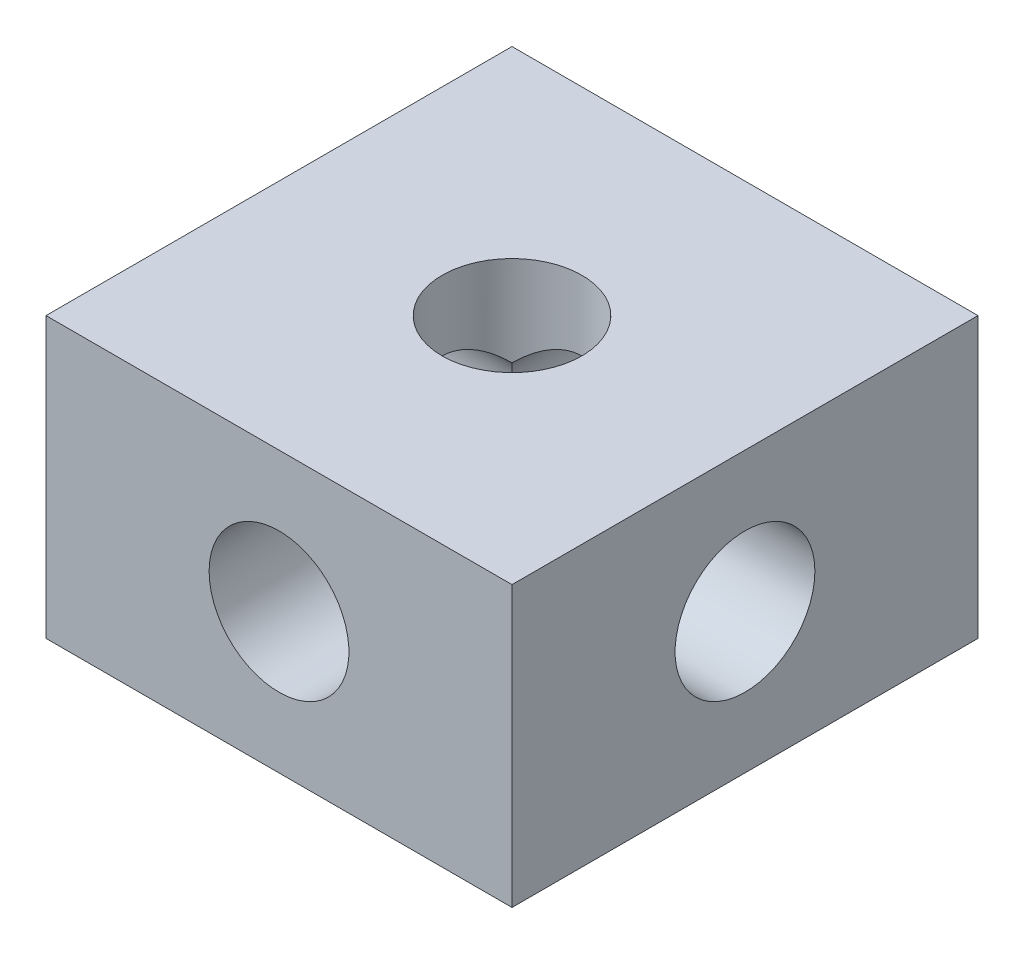
ISO-10303-21;
HEADER;
FILE_DESCRIPTION(('STEP AP214'),'2;1');
FILE_NAME('part.step','',(''),(''),'','','');
FILE_SCHEMA(('AUTOMOTIVE_DESIGN { 1 0 10303 214 1 1 1 1 }'));
ENDSEC;
DATA;
#1=APPLICATION_CONTEXT('core data for automotive mechanical design processes');
#2=APPLICATION_PROTOCOL_DEFINITION('international standard','automotive_design',2000,#1);
#3=PRODUCT_CONTEXT('',#1,'mechanical');
#4=PRODUCT('Part','Part','',(#3));
#5=PRODUCT_RELATED_PRODUCT_CATEGORY('part','',(#4));
#6=PRODUCT_DEFINITION_FORMATION('','',#4);
#7=PRODUCT_DEFINITION_CONTEXT('part definition',#1,'design');
#8=PRODUCT_DEFINITION('design','',#6,#7);
#9=PRODUCT_DEFINITION_SHAPE('','',#8);
#10=(LENGTH_UNIT() NAMED_UNIT(*) SI_UNIT(.MILLI.,.METRE.));
#11=(NAMED_UNIT(*) PLANE_ANGLE_UNIT() SI_UNIT($,.RADIAN.));
#12=(NAMED_UNIT(*) SI_UNIT($,.STERADIAN.) SOLID_ANGLE_UNIT());
#13=UNCERTAINTY_MEASURE_WITH_UNIT(LENGTH_MEASURE(1.E-05),#10,'distance_accuracy_value','');
#14=(GEOMETRIC_REPRESENTATION_CONTEXT(3) GLOBAL_UNCERTAINTY_ASSIGNED_CONTEXT((#13)) GLOBAL_UNIT_ASSIGNED_CONTEXT((#10,
#11,#12)) REPRESENTATION_CONTEXT('',''));
#15=CARTESIAN_POINT('',(0.,0.,0.));
#16=DIRECTION('',(0.,0.,1.));
#17=DIRECTION('',(1.,0.,0.));
#18=AXIS2_PLACEMENT_3D('',#15,#16,#17);
#19=CARTESIAN_POINT('',(0.,6.,0.));
#20=DIRECTION('',(0.,-1.,0.));
#21=DIRECTION('',(0.,0.,-1.));
#22=AXIS2_PLACEMENT_3D('',#19,#20,#21);
#23=CYLINDRICAL_SURFACE('',#22,1.5);
#24=CARTESIAN_POINT('',(0.,3.,0.));
#25=DIRECTION('',(0.707106781186547,-0.707106781186547,0.));
#26=DIRECTION('',(-0.707106781186547,-0.707106781186547,0.));
#27=AXIS2_PLACEMENT_3D('',#24,#25,#26);
#28=ELLIPSE('',#27,2.12132034355964,1.5);
#29=CARTESIAN_POINT('',(1.06066017177982,4.06066017177982,1.06066017177982));
#30=VERTEX_POINT('',#29);
#31=CARTESIAN_POINT('',(1.06066017177982,4.06066017177982,-1.06066017177982));
#32=VERTEX_POINT('',#31);
#33=EDGE_CURVE('E69',#30,#32,#28,.F.);
#34=ORIENTED_EDGE('',*,*,#33,.F.);
#35=CARTESIAN_POINT('',(0.,3.,0.));
#36=DIRECTION('',(0.,-0.707106781186547,0.707106781186547));
#37=DIRECTION('',(0.,-0.707106781186547,-0.707106781186547));
#38=AXIS2_PLACEMENT_3D('',#35,#36,#37);
#39=ELLIPSE('',#38,2.12132034355964,1.5);
#40=CARTESIAN_POINT('',(-1.06066017177982,4.06066017177982,1.06066017177982));
#41=VERTEX_POINT('',#40);
#42=EDGE_CURVE('E129',#41,#30,#39,.F.);
#43=ORIENTED_EDGE('',*,*,#42,.F.);
#44=CARTESIAN_POINT('',(0.,3.,0.));
#45=DIRECTION('',(-0.707106781186547,-0.707106781186547,0.));
#46=DIRECTION('',(0.707106781186547,-0.707106781186547,0.));
#47=AXIS2_PLACEMENT_3D('',#44,#45,#46);
#48=ELLIPSE('',#47,2.12132034355964,1.5);
#49=CARTESIAN_POINT('',(-1.06066017177982,4.06066017177982,-1.06066017177982));
#50=VERTEX_POINT('',#49);
#51=EDGE_CURVE('E141',#50,#41,#48,.F.);
#52=ORIENTED_EDGE('',*,*,#51,.F.);
#53=CARTESIAN_POINT('',(0.,3.,0.));
#54=DIRECTION('',(0.,-0.707106781186547,-0.707106781186547));
#55=DIRECTION('',(0.,-0.707106781186547,0.707106781186547));
#56=AXIS2_PLACEMENT_3D('',#53,#54,#55);
#57=ELLIPSE('',#56,2.12132034355964,1.5);
#58=EDGE_CURVE('E116',#32,#50,#57,.F.);
#59=ORIENTED_EDGE('',*,*,#58,.F.);
#60=EDGE_LOOP('',(#34,#43,#52,#59));
#61=FACE_BOUND('',#60,.T.);
#62=CARTESIAN_POINT('',(0.,6.,0.));
#63=DIRECTION('',(0.,1.,0.));
#64=DIRECTION('',(0.,0.,1.));
#65=AXIS2_PLACEMENT_3D('',#62,#63,#64);
#66=CIRCLE('',#65,1.5);
#67=CARTESIAN_POINT('',(0.,6.,1.5));
#68=VERTEX_POINT('',#67);
#69=EDGE_CURVE('E157',#68,#68,#66,.T.);
#70=ORIENTED_EDGE('',*,*,#69,.T.);
#71=EDGE_LOOP('',(#70));
#72=FACE_BOUND('',#71,.T.);
#73=ADVANCED_FACE('F47',(#61,#72),#23,.F.);
#74=CARTESIAN_POINT('',(0.,6.,0.));
#75=DIRECTION('',(0.,-1.,0.));
#76=DIRECTION('',(0.,0.,-1.));
#77=AXIS2_PLACEMENT_3D('',#74,#75,#76);
#78=PLANE('',#77);
#79=DIRECTION('',(0.,0.,-1.));
#80=VECTOR('',#79,1.);
#81=CARTESIAN_POINT('',(5.,6.,5.));
#82=LINE('',#81,#80);
#83=CARTESIAN_POINT('',(5.,6.,5.));
#84=VERTEX_POINT('',#83);
#85=CARTESIAN_POINT('',(5.,6.,-5.));
#86=VERTEX_POINT('',#85);
#87=EDGE_CURVE('E163',#84,#86,#82,.T.);
#88=ORIENTED_EDGE('',*,*,#87,.T.);
#89=DIRECTION('',(-1.,0.,0.));
#90=VECTOR('',#89,1.);
#91=CARTESIAN_POINT('',(-5.,6.,-5.));
#92=LINE('',#91,#90);
#93=CARTESIAN_POINT('',(-5.,6.,-5.));
#94=VERTEX_POINT('',#93);
#95=EDGE_CURVE('E166',#86,#94,#92,.T.);
#96=ORIENTED_EDGE('',*,*,#95,.T.);
#97=DIRECTION('',(0.,0.,1.));
#98=VECTOR('',#97,1.);
#99=CARTESIAN_POINT('',(-5.,6.,5.));
#100=LINE('',#99,#98);
#101=CARTESIAN_POINT('',(-5.,6.,5.));
#102=VERTEX_POINT('',#101);
#103=EDGE_CURVE('E169',#94,#102,#100,.T.);
#104=ORIENTED_EDGE('',*,*,#103,.T.);
#105=DIRECTION('',(1.,0.,0.));
#106=VECTOR('',#105,1.);
#107=CARTESIAN_POINT('',(-5.,6.,5.));
#108=LINE('',#107,#106);
#109=EDGE_CURVE('E171',#102,#84,#108,.T.);
#110=ORIENTED_EDGE('',*,*,#109,.T.);
#111=EDGE_LOOP('',(#88,#96,#104,#110));
#112=FACE_BOUND('',#111,.T.);
#113=ORIENTED_EDGE('',*,*,#69,.F.);
#114=EDGE_LOOP('',(#113));
#115=FACE_BOUND('',#114,.T.);
#116=ADVANCED_FACE('F210',(#112,#115),#78,.F.);
#117=CARTESIAN_POINT('',(0.,0.,0.));
#118=DIRECTION('',(0.,-1.,0.));
#119=DIRECTION('',(0.,0.,-1.));
#120=AXIS2_PLACEMENT_3D('',#117,#118,#119);
#121=PLANE('',#120);
#122=DIRECTION('',(0.,0.,-1.));
#123=VECTOR('',#122,1.);
#124=CARTESIAN_POINT('',(5.,0.,5.));
#125=LINE('',#124,#123);
#126=CARTESIAN_POINT('',(5.,0.,5.));
#127=VERTEX_POINT('',#126);
#128=CARTESIAN_POINT('',(5.,0.,-5.));
#129=VERTEX_POINT('',#128);
#130=EDGE_CURVE('E160',#127,#129,#125,.T.);
#131=ORIENTED_EDGE('',*,*,#130,.F.);
#132=DIRECTION('',(1.,0.,0.));
#133=VECTOR('',#132,1.);
#134=CARTESIAN_POINT('',(-5.,0.,5.));
#135=LINE('',#134,#133);
#136=CARTESIAN_POINT('',(-5.,0.,5.));
#137=VERTEX_POINT('',#136);
#138=EDGE_CURVE('E167',#137,#127,#135,.T.);
#139=ORIENTED_EDGE('',*,*,#138,.F.);
#140=DIRECTION('',(0.,0.,1.));
#141=VECTOR('',#140,1.);
#142=CARTESIAN_POINT('',(-5.,0.,5.));
#143=LINE('',#142,#141);
#144=CARTESIAN_POINT('',(-5.,0.,-5.));
#145=VERTEX_POINT('',#144);
#146=EDGE_CURVE('E178',#145,#137,#143,.T.);
#147=ORIENTED_EDGE('',*,*,#146,.F.);
#148=DIRECTION('',(-1.,0.,0.));
#149=VECTOR('',#148,1.);
#150=CARTESIAN_POINT('',(-5.,0.,-5.));
#151=LINE('',#150,#149);
#152=EDGE_CURVE('E176',#129,#145,#151,.T.);
#153=ORIENTED_EDGE('',*,*,#152,.F.);
#154=EDGE_LOOP('',(#131,#139,#147,#153));
#155=FACE_BOUND('',#154,.T.);
#156=CARTESIAN_POINT('',(0.,0.,0.));
#157=DIRECTION('',(0.,1.,0.));
#158=DIRECTION('',(0.,0.,1.));
#159=AXIS2_PLACEMENT_3D('',#156,#157,#158);
#160=CIRCLE('',#159,1.5);
#161=CARTESIAN_POINT('',(0.,0.,1.5));
#162=VERTEX_POINT('',#161);
#163=EDGE_CURVE('E154',#162,#162,#160,.T.);
#164=ORIENTED_EDGE('',*,*,#163,.T.);
#165=EDGE_LOOP('',(#164));
#166=FACE_BOUND('',#165,.T.);
#167=ADVANCED_FACE('F199',(#155,#166),#121,.T.);
#168=CARTESIAN_POINT('',(5.,6.,5.));
#169=DIRECTION('',(-1.,0.,0.));
#170=DIRECTION('',(0.,0.,1.));
#171=AXIS2_PLACEMENT_3D('',#168,#169,#170);
#172=PLANE('',#171);
#173=CARTESIAN_POINT('',(5.,3.,0.));
#174=DIRECTION('',(1.,0.,0.));
#175=DIRECTION('',(0.,0.,-1.));
#176=AXIS2_PLACEMENT_3D('',#173,#174,#175);
#177=CIRCLE('',#176,1.5);
#178=CARTESIAN_POINT('',(5.,3.,-1.5));
#179=VERTEX_POINT('',#178);
#180=EDGE_CURVE('E256',#179,#179,#177,.T.);
#181=ORIENTED_EDGE('',*,*,#180,.F.);
#182=EDGE_LOOP('',(#181));
#183=FACE_BOUND('',#182,.T.);
#184=ORIENTED_EDGE('',*,*,#130,.T.);
#185=DIRECTION('',(0.,-1.,0.));
#186=VECTOR('',#185,1.);
#187=CARTESIAN_POINT('',(5.,6.,-5.));
#188=LINE('',#187,#186);
#189=EDGE_CURVE('E133',#86,#129,#188,.T.);
#190=ORIENTED_EDGE('',*,*,#189,.F.);
#191=ORIENTED_EDGE('',*,*,#87,.F.);
#192=DIRECTION('',(0.,-1.,0.));
#193=VECTOR('',#192,1.);
#194=CARTESIAN_POINT('',(5.,6.,5.));
#195=LINE('',#194,#193);
#196=EDGE_CURVE('E173',#84,#127,#195,.T.);
#197=ORIENTED_EDGE('',*,*,#196,.T.);
#198=EDGE_LOOP('',(#184,#190,#191,#197));
#199=FACE_BOUND('',#198,.T.);
#200=ADVANCED_FACE('F49',(#183,#199),#172,.F.);
#201=CARTESIAN_POINT('',(-5.,6.,-5.));
#202=DIRECTION('',(0.,0.,1.));
#203=DIRECTION('',(1.,0.,0.));
#204=AXIS2_PLACEMENT_3D('',#201,#202,#203);
#205=PLANE('',#204);
#206=CARTESIAN_POINT('',(0.,3.,-5.));
#207=DIRECTION('',(0.,0.,-1.));
#208=DIRECTION('',(-1.,0.,0.));
#209=AXIS2_PLACEMENT_3D('',#206,#207,#208);
#210=CIRCLE('',#209,1.5);
#211=CARTESIAN_POINT('',(-1.5,3.,-5.));
#212=VERTEX_POINT('',#211);
#213=EDGE_CURVE('E145',#212,#212,#210,.T.);
#214=ORIENTED_EDGE('',*,*,#213,.F.);
#215=EDGE_LOOP('',(#214));
#216=FACE_BOUND('',#215,.T.);
#217=ORIENTED_EDGE('',*,*,#152,.T.);
#218=DIRECTION('',(0.,-1.,0.));
#219=VECTOR('',#218,1.);
#220=CARTESIAN_POINT('',(-5.,6.,-5.));
#221=LINE('',#220,#219);
#222=EDGE_CURVE('E186',#94,#145,#221,.T.);
#223=ORIENTED_EDGE('',*,*,#222,.F.);
#224=ORIENTED_EDGE('',*,*,#95,.F.);
#225=ORIENTED_EDGE('',*,*,#189,.T.);
#226=EDGE_LOOP('',(#217,#223,#224,#225));
#227=FACE_BOUND('',#226,.T.);
#228=ADVANCED_FACE('F191',(#216,#227),#205,.F.);
#229=CARTESIAN_POINT('',(-5.,6.,5.));
#230=DIRECTION('',(1.,0.,0.));
#231=DIRECTION('',(0.,0.,-1.));
#232=AXIS2_PLACEMENT_3D('',#229,#230,#231);
#233=PLANE('',#232);
#234=CARTESIAN_POINT('',(-5.,3.,0.));
#235=DIRECTION('',(1.,0.,0.));
#236=DIRECTION('',(0.,0.,-1.));
#237=AXIS2_PLACEMENT_3D('',#234,#235,#236);
#238=CIRCLE('',#237,1.5);
#239=CARTESIAN_POINT('',(-5.,3.,-1.5));
#240=VERTEX_POINT('',#239);
#241=EDGE_CURVE('E125',#240,#240,#238,.T.);
#242=ORIENTED_EDGE('',*,*,#241,.T.);
#243=EDGE_LOOP('',(#242));
#244=FACE_BOUND('',#243,.T.);
#245=ORIENTED_EDGE('',*,*,#146,.T.);
#246=DIRECTION('',(0.,-1.,0.));
#247=VECTOR('',#246,1.);
#248=CARTESIAN_POINT('',(-5.,6.,5.));
#249=LINE('',#248,#247);
#250=EDGE_CURVE('E183',#102,#137,#249,.T.);
#251=ORIENTED_EDGE('',*,*,#250,.F.);
#252=ORIENTED_EDGE('',*,*,#103,.F.);
#253=ORIENTED_EDGE('',*,*,#222,.T.);
#254=EDGE_LOOP('',(#245,#251,#252,#253));
#255=FACE_BOUND('',#254,.T.);
#256=ADVANCED_FACE('F204',(#244,#255),#233,.F.);
#257=CARTESIAN_POINT('',(-5.,6.,5.));
#258=DIRECTION('',(0.,0.,-1.));
#259=DIRECTION('',(-1.,0.,0.));
#260=AXIS2_PLACEMENT_3D('',#257,#258,#259);
#261=PLANE('',#260);
#262=CARTESIAN_POINT('',(0.,3.,5.));
#263=DIRECTION('',(0.,0.,-1.));
#264=DIRECTION('',(-1.,0.,0.));
#265=AXIS2_PLACEMENT_3D('',#262,#263,#264);
#266=CIRCLE('',#265,1.5);
#267=CARTESIAN_POINT('',(-1.5,3.,5.));
#268=VERTEX_POINT('',#267);
#269=EDGE_CURVE('E151',#268,#268,#266,.T.);
#270=ORIENTED_EDGE('',*,*,#269,.T.);
#271=EDGE_LOOP('',(#270));
#272=FACE_BOUND('',#271,.T.);
#273=ORIENTED_EDGE('',*,*,#138,.T.);
#274=ORIENTED_EDGE('',*,*,#196,.F.);
#275=ORIENTED_EDGE('',*,*,#109,.F.);
#276=ORIENTED_EDGE('',*,*,#250,.T.);
#277=EDGE_LOOP('',(#273,#274,#275,#276));
#278=FACE_BOUND('',#277,.T.);
#279=ADVANCED_FACE('F208',(#272,#278),#261,.F.);
#280=CARTESIAN_POINT('',(0.,3.,0.));
#281=DIRECTION('',(0.707106781186547,-0.707106781186547,0.));
#282=DIRECTION('',(-0.707106781186547,-0.707106781186547,0.));
#283=AXIS2_PLACEMENT_3D('',#280,#281,#282);
#284=ELLIPSE('',#283,2.12132034355964,1.5);
#285=CARTESIAN_POINT('',(-1.06066017177982,1.93933982822018,1.06066017177982));
#286=VERTEX_POINT('',#285);
#287=CARTESIAN_POINT('',(-1.06066017177982,1.93933982822018,-1.06066017177982));
#288=VERTEX_POINT('',#287);
#289=EDGE_CURVE('E62',#286,#288,#284,.T.);
#290=ORIENTED_EDGE('',*,*,#289,.F.);
#291=CARTESIAN_POINT('',(0.,3.,0.));
#292=DIRECTION('',(0.,-0.707106781186547,-0.707106781186547));
#293=DIRECTION('',(0.,-0.707106781186547,0.707106781186547));
#294=AXIS2_PLACEMENT_3D('',#291,#292,#293);
#295=ELLIPSE('',#294,2.12132034355964,1.5);
#296=CARTESIAN_POINT('',(1.06066017177982,1.93933982822018,1.06066017177982));
#297=VERTEX_POINT('',#296);
#298=EDGE_CURVE('E124',#297,#286,#295,.T.);
#299=ORIENTED_EDGE('',*,*,#298,.F.);
#300=CARTESIAN_POINT('',(0.,3.,0.));
#301=DIRECTION('',(-0.707106781186547,-0.707106781186547,0.));
#302=DIRECTION('',(0.707106781186547,-0.707106781186547,0.));
#303=AXIS2_PLACEMENT_3D('',#300,#301,#302);
#304=ELLIPSE('',#303,2.12132034355964,1.5);
#305=CARTESIAN_POINT('',(1.06066017177982,1.93933982822018,-1.06066017177982));
#306=VERTEX_POINT('',#305);
#307=EDGE_CURVE('E110',#306,#297,#304,.T.);
#308=ORIENTED_EDGE('',*,*,#307,.F.);
#309=CARTESIAN_POINT('',(0.,3.,0.));
#310=DIRECTION('',(0.,-0.707106781186547,0.707106781186547));
#311=DIRECTION('',(0.,-0.707106781186547,-0.707106781186547));
#312=AXIS2_PLACEMENT_3D('',#309,#310,#311);
#313=ELLIPSE('',#312,2.12132034355964,1.5);
#314=EDGE_CURVE('E122',#288,#306,#313,.T.);
#315=ORIENTED_EDGE('',*,*,#314,.F.);
#316=EDGE_LOOP('',(#290,#299,#308,#315));
#317=FACE_BOUND('',#316,.T.);
#318=ORIENTED_EDGE('',*,*,#163,.F.);
#319=EDGE_LOOP('',(#318));
#320=FACE_BOUND('',#319,.T.);
#321=ADVANCED_FACE('F120',(#317,#320),#23,.F.);
#322=CARTESIAN_POINT('',(0.,3.,5.));
#323=DIRECTION('',(0.,0.,-1.));
#324=DIRECTION('',(-1.,0.,0.));
#325=AXIS2_PLACEMENT_3D('',#322,#323,#324);
#326=CYLINDRICAL_SURFACE('',#325,1.5);
#327=ORIENTED_EDGE('',*,*,#42,.T.);
#328=CARTESIAN_POINT('',(0.,3.,0.));
#329=DIRECTION('',(0.707106781186547,0.,-0.707106781186547));
#330=DIRECTION('',(-0.707106781186547,0.,-0.707106781186547));
#331=AXIS2_PLACEMENT_3D('',#328,#329,#330);
#332=ELLIPSE('',#331,2.12132034355964,1.5);
#333=EDGE_CURVE('E147',#30,#297,#332,.T.);
#334=ORIENTED_EDGE('',*,*,#333,.T.);
#335=ORIENTED_EDGE('',*,*,#298,.T.);
#336=CARTESIAN_POINT('',(0.,3.,0.));
#337=DIRECTION('',(-0.707106781186547,0.,-0.707106781186547));
#338=DIRECTION('',(0.707106781186547,0.,-0.707106781186547));
#339=AXIS2_PLACEMENT_3D('',#336,#337,#338);
#340=ELLIPSE('',#339,2.12132034355964,1.5);
#341=EDGE_CURVE('E143',#286,#41,#340,.T.);
#342=ORIENTED_EDGE('',*,*,#341,.T.);
#343=EDGE_LOOP('',(#327,#334,#335,#342));
#344=FACE_BOUND('',#343,.T.);
#345=ORIENTED_EDGE('',*,*,#269,.F.);
#346=EDGE_LOOP('',(#345));
#347=FACE_BOUND('',#346,.T.);
#348=ADVANCED_FACE('F223',(#344,#347),#326,.F.);
#349=ORIENTED_EDGE('',*,*,#58,.T.);
#350=CARTESIAN_POINT('',(0.,3.,0.));
#351=DIRECTION('',(0.707106781186547,0.,-0.707106781186547));
#352=DIRECTION('',(-0.707106781186547,0.,-0.707106781186547));
#353=AXIS2_PLACEMENT_3D('',#350,#351,#352);
#354=ELLIPSE('',#353,2.12132034355964,1.5);
#355=EDGE_CURVE('E11',#50,#288,#354,.F.);
#356=ORIENTED_EDGE('',*,*,#355,.T.);
#357=ORIENTED_EDGE('',*,*,#314,.T.);
#358=CARTESIAN_POINT('',(0.,3.,0.));
#359=DIRECTION('',(-0.707106781186547,0.,-0.707106781186547));
#360=DIRECTION('',(0.707106781186547,0.,-0.707106781186547));
#361=AXIS2_PLACEMENT_3D('',#358,#359,#360);
#362=ELLIPSE('',#361,2.12132034355964,1.5);
#363=EDGE_CURVE('E55',#306,#32,#362,.F.);
#364=ORIENTED_EDGE('',*,*,#363,.T.);
#365=EDGE_LOOP('',(#349,#356,#357,#364));
#366=FACE_BOUND('',#365,.T.);
#367=ORIENTED_EDGE('',*,*,#213,.T.);
#368=EDGE_LOOP('',(#367));
#369=FACE_BOUND('',#368,.T.);
#370=ADVANCED_FACE('F127',(#366,#369),#326,.F.);
#371=CARTESIAN_POINT('',(-5.,3.,0.));
#372=DIRECTION('',(1.,0.,0.));
#373=DIRECTION('',(0.,0.,-1.));
#374=AXIS2_PLACEMENT_3D('',#371,#372,#373);
#375=CYLINDRICAL_SURFACE('',#374,1.5);
#376=ORIENTED_EDGE('',*,*,#180,.T.);
#377=EDGE_LOOP('',(#376));
#378=FACE_BOUND('',#377,.T.);
#379=ORIENTED_EDGE('',*,*,#33,.T.);
#380=ORIENTED_EDGE('',*,*,#363,.F.);
#381=ORIENTED_EDGE('',*,*,#307,.T.);
#382=ORIENTED_EDGE('',*,*,#333,.F.);
#383=EDGE_LOOP('',(#379,#380,#381,#382));
#384=FACE_BOUND('',#383,.T.);
#385=ADVANCED_FACE('F109',(#378,#384),#375,.F.);
#386=ORIENTED_EDGE('',*,*,#241,.F.);
#387=EDGE_LOOP('',(#386));
#388=FACE_BOUND('',#387,.T.);
#389=ORIENTED_EDGE('',*,*,#289,.T.);
#390=ORIENTED_EDGE('',*,*,#355,.F.);
#391=ORIENTED_EDGE('',*,*,#51,.T.);
#392=ORIENTED_EDGE('',*,*,#341,.F.);
#393=EDGE_LOOP('',(#389,#390,#391,#392));
#394=FACE_BOUND('',#393,.T.);
#395=ADVANCED_FACE('F247',(#388,#394),#375,.F.);
#396=CLOSED_SHELL('',(#73,#116,#167,#200,#228,#256,#279,#321,#348,#370,#385,#395));
#397=MANIFOLD_SOLID_BREP('B2',#396);
#398=ADVANCED_BREP_SHAPE_REPRESENTATION('',(#18,#397),#14);
#399=SHAPE_DEFINITION_REPRESENTATION(#9,#398);
ENDSEC;
END-ISO-10303-21;
